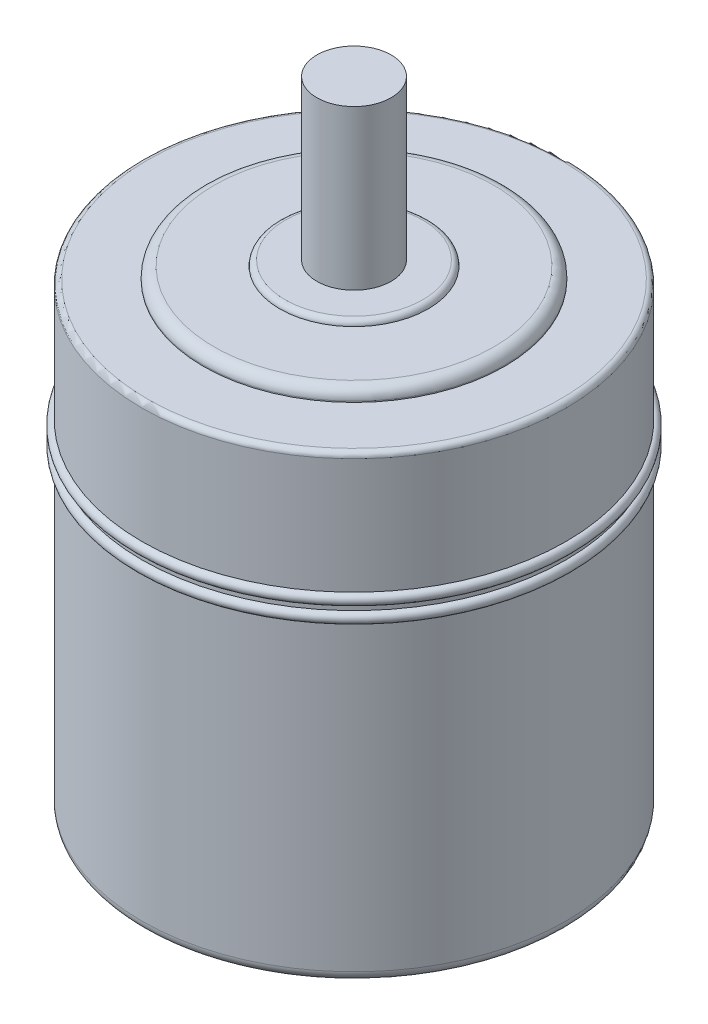
ISO-10303-21;
HEADER;
FILE_DESCRIPTION(('STEP AP214'),'2;1');
FILE_NAME('part.step','',(''),(''),'','','');
FILE_SCHEMA(('AUTOMOTIVE_DESIGN { 1 0 10303 214 1 1 1 1 }'));
ENDSEC;
DATA;
#1=APPLICATION_CONTEXT('core data for automotive mechanical design processes');
#2=APPLICATION_PROTOCOL_DEFINITION('international standard','automotive_design',2000,#1);
#3=PRODUCT_CONTEXT('',#1,'mechanical');
#4=PRODUCT('Part','Part','',(#3));
#5=PRODUCT_RELATED_PRODUCT_CATEGORY('part','',(#4));
#6=PRODUCT_DEFINITION_FORMATION('','',#4);
#7=PRODUCT_DEFINITION_CONTEXT('part definition',#1,'design');
#8=PRODUCT_DEFINITION('design','',#6,#7);
#9=PRODUCT_DEFINITION_SHAPE('','',#8);
#10=(LENGTH_UNIT() NAMED_UNIT(*) SI_UNIT(.MILLI.,.METRE.));
#11=(NAMED_UNIT(*) PLANE_ANGLE_UNIT() SI_UNIT($,.RADIAN.));
#12=(NAMED_UNIT(*) SI_UNIT($,.STERADIAN.) SOLID_ANGLE_UNIT());
#13=UNCERTAINTY_MEASURE_WITH_UNIT(LENGTH_MEASURE(1.E-05),#10,'distance_accuracy_value','');
#14=(GEOMETRIC_REPRESENTATION_CONTEXT(3) GLOBAL_UNCERTAINTY_ASSIGNED_CONTEXT((#13)) GLOBAL_UNIT_ASSIGNED_CONTEXT((#10,
#11,#12)) REPRESENTATION_CONTEXT('',''));
#15=CARTESIAN_POINT('',(0.,0.,0.));
#16=DIRECTION('',(0.,0.,1.));
#17=DIRECTION('',(1.,0.,0.));
#18=AXIS2_PLACEMENT_3D('',#15,#16,#17);
#19=CARTESIAN_POINT('',(0.,76.2,0.));
#20=DIRECTION('',(0.,1.,0.));
#21=DIRECTION('',(-1.,0.,0.));
#22=AXIS2_PLACEMENT_3D('',#19,#20,#21);
#23=PLANE('',#22);
#24=CARTESIAN_POINT('',(0.,76.2,0.));
#25=DIRECTION('',(0.,-1.,0.));
#26=DIRECTION('',(1.,0.,0.));
#27=AXIS2_PLACEMENT_3D('',#24,#25,#26);
#28=CIRCLE('',#27,4.445);
#29=CARTESIAN_POINT('',(4.44499999999998,76.2,0.));
#30=VERTEX_POINT('',#29);
#31=EDGE_CURVE('E80',#30,#30,#28,.T.);
#32=ORIENTED_EDGE('',*,*,#31,.F.);
#33=EDGE_LOOP('',(#32));
#34=FACE_BOUND('',#33,.T.);
#35=ADVANCED_FACE('F39',(#34),#23,.T.);
#36=CARTESIAN_POINT('',(0.,0.,0.));
#37=DIRECTION('',(0.,-1.,0.));
#38=DIRECTION('',(1.,0.,0.));
#39=AXIS2_PLACEMENT_3D('',#36,#37,#38);
#40=CYLINDRICAL_SURFACE('',#39,4.445);
#41=ORIENTED_EDGE('',*,*,#31,.T.);
#42=EDGE_LOOP('',(#41));
#43=FACE_BOUND('',#42,.T.);
#44=CARTESIAN_POINT('',(0.,57.15,0.));
#45=DIRECTION('',(0.,-1.,0.));
#46=DIRECTION('',(1.,0.,0.));
#47=AXIS2_PLACEMENT_3D('',#44,#45,#46);
#48=CIRCLE('',#47,4.445);
#49=CARTESIAN_POINT('',(4.44499999999998,57.15,0.));
#50=VERTEX_POINT('',#49);
#51=EDGE_CURVE('E83',#50,#50,#48,.T.);
#52=ORIENTED_EDGE('',*,*,#51,.F.);
#53=EDGE_LOOP('',(#52));
#54=FACE_BOUND('',#53,.T.);
#55=ADVANCED_FACE('F110',(#43,#54),#40,.T.);
#56=CARTESIAN_POINT('',(4.44499999999998,57.15,0.));
#57=DIRECTION('',(0.,1.,0.));
#58=DIRECTION('',(-1.,0.,0.));
#59=AXIS2_PLACEMENT_3D('',#56,#57,#58);
#60=PLANE('',#59);
#61=CARTESIAN_POINT('',(0.,57.15,0.));
#62=DIRECTION('',(0.,1.,0.));
#63=DIRECTION('',(-1.,0.,0.));
#64=AXIS2_PLACEMENT_3D('',#61,#62,#63);
#65=CIRCLE('',#64,8.25500000000001);
#66=CARTESIAN_POINT('',(-8.25500000000002,57.15,0.));
#67=VERTEX_POINT('',#66);
#68=EDGE_CURVE('E65',#67,#67,#65,.T.);
#69=ORIENTED_EDGE('',*,*,#68,.T.);
#70=EDGE_LOOP('',(#69));
#71=FACE_BOUND('',#70,.T.);
#72=ORIENTED_EDGE('',*,*,#51,.T.);
#73=EDGE_LOOP('',(#72));
#74=FACE_BOUND('',#73,.T.);
#75=ADVANCED_FACE('F106',(#71,#74),#60,.T.);
#76=CARTESIAN_POINT('',(8.88999999999999,56.515,0.));
#77=DIRECTION('',(0.,1.,0.));
#78=DIRECTION('',(-1.,0.,0.));
#79=AXIS2_PLACEMENT_3D('',#76,#77,#78);
#80=PLANE('',#79);
#81=CARTESIAN_POINT('',(0.,56.515,0.));
#82=DIRECTION('',(0.,1.,0.));
#83=DIRECTION('',(-1.,0.,0.));
#84=AXIS2_PLACEMENT_3D('',#81,#82,#83);
#85=CIRCLE('',#84,16.764);
#86=CARTESIAN_POINT('',(-16.764,56.515,0.));
#87=VERTEX_POINT('',#86);
#88=EDGE_CURVE('E50',#87,#87,#85,.T.);
#89=ORIENTED_EDGE('',*,*,#88,.T.);
#90=EDGE_LOOP('',(#89));
#91=FACE_BOUND('',#90,.T.);
#92=CARTESIAN_POINT('',(0.,56.515,0.));
#93=DIRECTION('',(0.,-1.,0.));
#94=DIRECTION('',(1.,0.,0.));
#95=AXIS2_PLACEMENT_3D('',#92,#93,#94);
#96=CIRCLE('',#95,8.89000000000001);
#97=CARTESIAN_POINT('',(8.88999999999999,56.515,0.));
#98=VERTEX_POINT('',#97);
#99=EDGE_CURVE('E86',#98,#98,#96,.T.);
#100=ORIENTED_EDGE('',*,*,#99,.T.);
#101=EDGE_LOOP('',(#100));
#102=FACE_BOUND('',#101,.T.);
#103=ADVANCED_FACE('F97',(#91,#102),#80,.T.);
#104=CARTESIAN_POINT('',(0.,0.,0.));
#105=DIRECTION('',(0.,-1.,0.));
#106=DIRECTION('',(1.,0.,0.));
#107=AXIS2_PLACEMENT_3D('',#104,#105,#106);
#108=CYLINDRICAL_SURFACE('',#107,18.034);
#109=CARTESIAN_POINT('',(0.,55.245,0.));
#110=DIRECTION('',(0.,1.,0.));
#111=DIRECTION('',(-1.,0.,0.));
#112=AXIS2_PLACEMENT_3D('',#109,#110,#111);
#113=CIRCLE('',#112,18.034);
#114=CARTESIAN_POINT('',(-18.034,55.245,0.));
#115=VERTEX_POINT('',#114);
#116=EDGE_CURVE('E54',#115,#115,#113,.F.);
#117=ORIENTED_EDGE('',*,*,#116,.T.);
#118=EDGE_LOOP('',(#117));
#119=FACE_BOUND('',#118,.T.);
#120=CARTESIAN_POINT('',(0.,55.118,0.));
#121=DIRECTION('',(0.,-1.,0.));
#122=DIRECTION('',(1.,0.,0.));
#123=AXIS2_PLACEMENT_3D('',#120,#121,#122);
#124=CIRCLE('',#123,18.034);
#125=CARTESIAN_POINT('',(18.034,55.118,0.));
#126=VERTEX_POINT('',#125);
#127=EDGE_CURVE('E89',#126,#126,#124,.T.);
#128=ORIENTED_EDGE('',*,*,#127,.F.);
#129=EDGE_LOOP('',(#128));
#130=FACE_BOUND('',#129,.T.);
#131=ADVANCED_FACE('F95',(#119,#130),#108,.T.);
#132=CARTESIAN_POINT('',(18.034,55.118,0.));
#133=DIRECTION('',(0.,1.,0.));
#134=DIRECTION('',(-1.,0.,0.));
#135=AXIS2_PLACEMENT_3D('',#132,#133,#134);
#136=PLANE('',#135);
#137=CARTESIAN_POINT('',(0.,55.118,0.));
#138=DIRECTION('',(0.,1.,0.));
#139=DIRECTION('',(-1.,0.,0.));
#140=AXIS2_PLACEMENT_3D('',#137,#138,#139);
#141=CIRCLE('',#140,24.765);
#142=CARTESIAN_POINT('',(-24.765,55.118,0.));
#143=VERTEX_POINT('',#142);
#144=EDGE_CURVE('E10',#143,#143,#141,.T.);
#145=ORIENTED_EDGE('',*,*,#144,.T.);
#146=EDGE_LOOP('',(#145));
#147=FACE_BOUND('',#146,.T.);
#148=ORIENTED_EDGE('',*,*,#127,.T.);
#149=EDGE_LOOP('',(#148));
#150=FACE_BOUND('',#149,.T.);
#151=ADVANCED_FACE('F93',(#147,#150),#136,.T.);
#152=CARTESIAN_POINT('',(0.,0.,0.));
#153=DIRECTION('',(0.,-1.,0.));
#154=DIRECTION('',(1.,0.,0.));
#155=AXIS2_PLACEMENT_3D('',#152,#153,#154);
#156=CYLINDRICAL_SURFACE('',#155,25.4);
#157=CARTESIAN_POINT('',(0.,54.483,0.));
#158=DIRECTION('',(0.,1.,0.));
#159=DIRECTION('',(-1.,0.,0.));
#160=AXIS2_PLACEMENT_3D('',#157,#158,#159);
#161=CIRCLE('',#160,25.4);
#162=CARTESIAN_POINT('',(-25.4,54.483,0.));
#163=VERTEX_POINT('',#162);
#164=EDGE_CURVE('E46',#163,#163,#161,.F.);
#165=ORIENTED_EDGE('',*,*,#164,.T.);
#166=EDGE_LOOP('',(#165));
#167=FACE_BOUND('',#166,.T.);
#168=CARTESIAN_POINT('',(0.,40.64,0.));
#169=DIRECTION('',(0.,-1.,0.));
#170=DIRECTION('',(0.,0.,-1.));
#171=AXIS2_PLACEMENT_3D('',#168,#169,#170);
#172=CIRCLE('',#171,25.4);
#173=CARTESIAN_POINT('',(0.,40.64,-25.4));
#174=VERTEX_POINT('',#173);
#175=EDGE_CURVE('E77',#174,#174,#172,.T.);
#176=ORIENTED_EDGE('',*,*,#175,.F.);
#177=EDGE_LOOP('',(#176));
#178=FACE_BOUND('',#177,.T.);
#179=ADVANCED_FACE('F104',(#167,#178),#156,.T.);
#180=CARTESIAN_POINT('',(0.,40.005,0.));
#181=DIRECTION('',(0.,-1.,0.));
#182=DIRECTION('',(0.,0.,-1.));
#183=AXIS2_PLACEMENT_3D('',#180,#181,#182);
#184=TOROIDAL_SURFACE('',#183,25.4,0.634999999999999);
#185=CARTESIAN_POINT('',(0.,39.37,0.));
#186=DIRECTION('',(0.,1.,0.));
#187=DIRECTION('',(0.,0.,1.));
#188=AXIS2_PLACEMENT_3D('',#185,#186,#187);
#189=CIRCLE('',#188,25.4);
#190=CARTESIAN_POINT('',(0.,39.37,25.4));
#191=VERTEX_POINT('',#190);
#192=EDGE_CURVE('E74',#191,#191,#189,.T.);
#193=ORIENTED_EDGE('',*,*,#192,.T.);
#194=EDGE_LOOP('',(#193));
#195=FACE_BOUND('',#194,.T.);
#196=ORIENTED_EDGE('',*,*,#175,.T.);
#197=EDGE_LOOP('',(#196));
#198=FACE_BOUND('',#197,.T.);
#199=ADVANCED_FACE('F161',(#195,#198),#184,.T.);
#200=CARTESIAN_POINT('',(0.,38.735,0.));
#201=DIRECTION('',(0.,-1.,0.));
#202=DIRECTION('',(0.,0.,-1.));
#203=AXIS2_PLACEMENT_3D('',#200,#201,#202);
#204=CIRCLE('',#203,25.4);
#205=CARTESIAN_POINT('',(0.,38.735,-25.4));
#206=VERTEX_POINT('',#205);
#207=EDGE_CURVE('E71',#206,#206,#204,.T.);
#208=ORIENTED_EDGE('',*,*,#207,.F.);
#209=EDGE_LOOP('',(#208));
#210=FACE_BOUND('',#209,.T.);
#211=ORIENTED_EDGE('',*,*,#192,.F.);
#212=EDGE_LOOP('',(#211));
#213=FACE_BOUND('',#212,.T.);
#214=ADVANCED_FACE('F163',(#210,#213),#156,.T.);
#215=CARTESIAN_POINT('',(0.,38.1,0.));
#216=DIRECTION('',(0.,-1.,0.));
#217=DIRECTION('',(0.,0.,-1.));
#218=AXIS2_PLACEMENT_3D('',#215,#216,#217);
#219=TOROIDAL_SURFACE('',#218,25.4,0.634999999999999);
#220=CARTESIAN_POINT('',(0.,37.465,0.));
#221=DIRECTION('',(0.,1.,0.));
#222=DIRECTION('',(0.,0.,1.));
#223=AXIS2_PLACEMENT_3D('',#220,#221,#222);
#224=CIRCLE('',#223,25.4);
#225=CARTESIAN_POINT('',(0.,37.465,25.4));
#226=VERTEX_POINT('',#225);
#227=EDGE_CURVE('E68',#226,#226,#224,.T.);
#228=ORIENTED_EDGE('',*,*,#227,.T.);
#229=EDGE_LOOP('',(#228));
#230=FACE_BOUND('',#229,.T.);
#231=ORIENTED_EDGE('',*,*,#207,.T.);
#232=EDGE_LOOP('',(#231));
#233=FACE_BOUND('',#232,.T.);
#234=ADVANCED_FACE('F125',(#230,#233),#219,.T.);
#235=CARTESIAN_POINT('',(25.4,0.,0.));
#236=DIRECTION('',(0.,-1.,0.));
#237=DIRECTION('',(1.,0.,0.));
#238=AXIS2_PLACEMENT_3D('',#235,#236,#237);
#239=PLANE('',#238);
#240=CARTESIAN_POINT('',(0.,0.,0.));
#241=DIRECTION('',(0.,-1.,0.));
#242=DIRECTION('',(1.,0.,0.));
#243=AXIS2_PLACEMENT_3D('',#240,#241,#242);
#244=CIRCLE('',#243,24.13);
#245=CARTESIAN_POINT('',(24.13,0.,0.));
#246=VERTEX_POINT('',#245);
#247=EDGE_CURVE('E62',#246,#246,#244,.T.);
#248=ORIENTED_EDGE('',*,*,#247,.T.);
#249=EDGE_LOOP('',(#248));
#250=FACE_BOUND('',#249,.T.);
#251=ADVANCED_FACE('F121',(#250),#239,.T.);
#252=CARTESIAN_POINT('',(0.,1.27,0.));
#253=DIRECTION('',(0.,-1.,0.));
#254=DIRECTION('',(1.,0.,0.));
#255=AXIS2_PLACEMENT_3D('',#252,#253,#254);
#256=CIRCLE('',#255,25.4);
#257=CARTESIAN_POINT('',(25.4,1.27,0.));
#258=VERTEX_POINT('',#257);
#259=EDGE_CURVE('E59',#258,#258,#256,.F.);
#260=ORIENTED_EDGE('',*,*,#259,.T.);
#261=EDGE_LOOP('',(#260));
#262=FACE_BOUND('',#261,.T.);
#263=ORIENTED_EDGE('',*,*,#227,.F.);
#264=EDGE_LOOP('',(#263));
#265=FACE_BOUND('',#264,.T.);
#266=ADVANCED_FACE('F124',(#262,#265),#156,.T.);
#267=CARTESIAN_POINT('',(0.,56.515,0.));
#268=DIRECTION('',(0.,1.,0.));
#269=DIRECTION('',(-1.,0.,0.));
#270=AXIS2_PLACEMENT_3D('',#267,#268,#269);
#271=TOROIDAL_SURFACE('',#270,8.25500000000001,0.635);
#272=ORIENTED_EDGE('',*,*,#68,.F.);
#273=EDGE_LOOP('',(#272));
#274=FACE_BOUND('',#273,.T.);
#275=ORIENTED_EDGE('',*,*,#99,.F.);
#276=EDGE_LOOP('',(#275));
#277=FACE_BOUND('',#276,.T.);
#278=ADVANCED_FACE('F127',(#274,#277),#271,.T.);
#279=CARTESIAN_POINT('',(0.,1.27,0.));
#280=DIRECTION('',(0.,-1.,0.));
#281=DIRECTION('',(1.,0.,0.));
#282=AXIS2_PLACEMENT_3D('',#279,#280,#281);
#283=TOROIDAL_SURFACE('',#282,24.13,1.27);
#284=ORIENTED_EDGE('',*,*,#259,.F.);
#285=EDGE_LOOP('',(#284));
#286=FACE_BOUND('',#285,.T.);
#287=ORIENTED_EDGE('',*,*,#247,.F.);
#288=EDGE_LOOP('',(#287));
#289=FACE_BOUND('',#288,.T.);
#290=ADVANCED_FACE('F130',(#286,#289),#283,.T.);
#291=CARTESIAN_POINT('',(0.,55.245,0.));
#292=DIRECTION('',(0.,1.,0.));
#293=DIRECTION('',(-1.,0.,0.));
#294=AXIS2_PLACEMENT_3D('',#291,#292,#293);
#295=TOROIDAL_SURFACE('',#294,16.764,1.27);
#296=ORIENTED_EDGE('',*,*,#88,.F.);
#297=EDGE_LOOP('',(#296));
#298=FACE_BOUND('',#297,.T.);
#299=ORIENTED_EDGE('',*,*,#116,.F.);
#300=EDGE_LOOP('',(#299));
#301=FACE_BOUND('',#300,.T.);
#302=ADVANCED_FACE('F133',(#298,#301),#295,.T.);
#303=CARTESIAN_POINT('',(0.,54.483,0.));
#304=DIRECTION('',(0.,1.,0.));
#305=DIRECTION('',(-1.,0.,0.));
#306=AXIS2_PLACEMENT_3D('',#303,#304,#305);
#307=TOROIDAL_SURFACE('',#306,24.765,0.635);
#308=ORIENTED_EDGE('',*,*,#144,.F.);
#309=EDGE_LOOP('',(#308));
#310=FACE_BOUND('',#309,.T.);
#311=ORIENTED_EDGE('',*,*,#164,.F.);
#312=EDGE_LOOP('',(#311));
#313=FACE_BOUND('',#312,.T.);
#314=ADVANCED_FACE('F41',(#310,#313),#307,.T.);
#315=CLOSED_SHELL('',(#35,#55,#75,#103,#131,#151,#179,#199,#214,#234,#251,#266,#278,#290,#302,#314));
#316=MANIFOLD_SOLID_BREP('B2',#315);
#317=ADVANCED_BREP_SHAPE_REPRESENTATION('',(#18,#316),#14);
#318=SHAPE_DEFINITION_REPRESENTATION(#9,#317);
ENDSEC;
END-ISO-10303-21;
